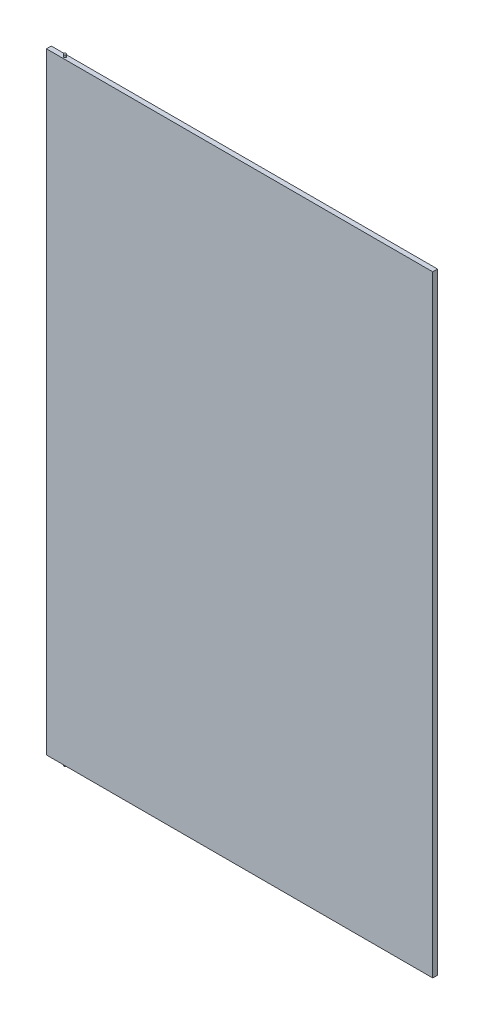
ISO-10303-21;
HEADER;
FILE_DESCRIPTION(('STEP AP214'),'2;1');
FILE_NAME('part.step','',(''),(''),'','','');
FILE_SCHEMA(('AUTOMOTIVE_DESIGN { 1 0 10303 214 1 1 1 1 }'));
ENDSEC;
DATA;
#1=APPLICATION_CONTEXT('core data for automotive mechanical design processes');
#2=APPLICATION_PROTOCOL_DEFINITION('international standard','automotive_design',2000,#1);
#3=PRODUCT_CONTEXT('',#1,'mechanical');
#4=PRODUCT('Part','Part','',(#3));
#5=PRODUCT_RELATED_PRODUCT_CATEGORY('part','',(#4));
#6=PRODUCT_DEFINITION_FORMATION('','',#4);
#7=PRODUCT_DEFINITION_CONTEXT('part definition',#1,'design');
#8=PRODUCT_DEFINITION('design','',#6,#7);
#9=PRODUCT_DEFINITION_SHAPE('','',#8);
#10=(LENGTH_UNIT() NAMED_UNIT(*) SI_UNIT(.MILLI.,.METRE.));
#11=(NAMED_UNIT(*) PLANE_ANGLE_UNIT() SI_UNIT($,.RADIAN.));
#12=(NAMED_UNIT(*) SI_UNIT($,.STERADIAN.) SOLID_ANGLE_UNIT());
#13=UNCERTAINTY_MEASURE_WITH_UNIT(LENGTH_MEASURE(1.E-05),#10,'distance_accuracy_value','');
#14=(GEOMETRIC_REPRESENTATION_CONTEXT(3) GLOBAL_UNCERTAINTY_ASSIGNED_CONTEXT((#13)) GLOBAL_UNIT_ASSIGNED_CONTEXT((#10,
#11,#12)) REPRESENTATION_CONTEXT('',''));
#15=CARTESIAN_POINT('',(0.,0.,0.));
#16=DIRECTION('',(0.,0.,1.));
#17=DIRECTION('',(1.,0.,0.));
#18=AXIS2_PLACEMENT_3D('',#15,#16,#17);
#19=CARTESIAN_POINT('',(0.,0.,3.));
#20=DIRECTION('',(-1.,0.,0.));
#21=DIRECTION('',(0.,0.,1.));
#22=AXIS2_PLACEMENT_3D('',#19,#20,#21);
#23=PLANE('',#22);
#24=DIRECTION('',(0.,1.,0.));
#25=VECTOR('',#24,1.);
#26=CARTESIAN_POINT('',(0.,0.,0.));
#27=LINE('',#26,#25);
#28=CARTESIAN_POINT('',(0.,0.,0.));
#29=VERTEX_POINT('',#28);
#30=CARTESIAN_POINT('',(0.,380.,0.));
#31=VERTEX_POINT('',#30);
#32=EDGE_CURVE('E117',#29,#31,#27,.T.);
#33=ORIENTED_EDGE('',*,*,#32,.T.);
#34=DIRECTION('',(0.,0.,-1.));
#35=VECTOR('',#34,1.);
#36=CARTESIAN_POINT('',(0.,380.,3.));
#37=LINE('',#36,#35);
#38=CARTESIAN_POINT('',(0.,380.,3.));
#39=VERTEX_POINT('',#38);
#40=EDGE_CURVE('E106',#39,#31,#37,.T.);
#41=ORIENTED_EDGE('',*,*,#40,.F.);
#42=DIRECTION('',(0.,1.,0.));
#43=VECTOR('',#42,1.);
#44=CARTESIAN_POINT('',(0.,0.,3.));
#45=LINE('',#44,#43);
#46=CARTESIAN_POINT('',(0.,0.,3.));
#47=VERTEX_POINT('',#46);
#48=EDGE_CURVE('E98',#47,#39,#45,.T.);
#49=ORIENTED_EDGE('',*,*,#48,.F.);
#50=DIRECTION('',(0.,0.,-1.));
#51=VECTOR('',#50,1.);
#52=CARTESIAN_POINT('',(0.,0.,3.));
#53=LINE('',#52,#51);
#54=EDGE_CURVE('E113',#47,#29,#53,.T.);
#55=ORIENTED_EDGE('',*,*,#54,.T.);
#56=EDGE_LOOP('',(#33,#41,#49,#55));
#57=FACE_BOUND('',#56,.T.);
#58=ADVANCED_FACE('F45',(#57),#23,.F.);
#59=CARTESIAN_POINT('',(0.,380.,3.));
#60=DIRECTION('',(0.,-1.,0.));
#61=DIRECTION('',(1.,0.,0.));
#62=AXIS2_PLACEMENT_3D('',#59,#60,#61);
#63=PLANE('',#62);
#64=CARTESIAN_POINT('',(-230.,380.,1.5));
#65=DIRECTION('',(0.,-1.,0.));
#66=DIRECTION('',(1.,0.,0.));
#67=AXIS2_PLACEMENT_3D('',#64,#65,#66);
#68=CIRCLE('',#67,0.750000000000041);
#69=CARTESIAN_POINT('',(-229.25,380.,1.5));
#70=VERTEX_POINT('',#69);
#71=EDGE_CURVE('E11',#70,#70,#68,.F.);
#72=ORIENTED_EDGE('',*,*,#71,.F.);
#73=EDGE_LOOP('',(#72));
#74=FACE_BOUND('',#73,.T.);
#75=DIRECTION('',(-1.,0.,0.));
#76=VECTOR('',#75,1.);
#77=CARTESIAN_POINT('',(0.,380.,0.));
#78=LINE('',#77,#76);
#79=CARTESIAN_POINT('',(-240.,380.,0.));
#80=VERTEX_POINT('',#79);
#81=EDGE_CURVE('E104',#31,#80,#78,.T.);
#82=ORIENTED_EDGE('',*,*,#81,.T.);
#83=DIRECTION('',(0.,0.,-1.));
#84=VECTOR('',#83,1.);
#85=CARTESIAN_POINT('',(-240.,380.,3.));
#86=LINE('',#85,#84);
#87=CARTESIAN_POINT('',(-240.,380.,3.));
#88=VERTEX_POINT('',#87);
#89=EDGE_CURVE('E102',#88,#80,#86,.T.);
#90=ORIENTED_EDGE('',*,*,#89,.F.);
#91=DIRECTION('',(-1.,0.,0.));
#92=VECTOR('',#91,1.);
#93=CARTESIAN_POINT('',(0.,380.,3.));
#94=LINE('',#93,#92);
#95=EDGE_CURVE('E93',#39,#88,#94,.T.);
#96=ORIENTED_EDGE('',*,*,#95,.F.);
#97=ORIENTED_EDGE('',*,*,#40,.T.);
#98=EDGE_LOOP('',(#82,#90,#96,#97));
#99=FACE_BOUND('',#98,.T.);
#100=ADVANCED_FACE('F103',(#74,#99),#63,.F.);
#101=CARTESIAN_POINT('',(-240.,0.,3.));
#102=DIRECTION('',(1.,0.,0.));
#103=DIRECTION('',(0.,0.,-1.));
#104=AXIS2_PLACEMENT_3D('',#101,#102,#103);
#105=PLANE('',#104);
#106=DIRECTION('',(0.,-1.,0.));
#107=VECTOR('',#106,1.);
#108=CARTESIAN_POINT('',(-240.,0.,0.));
#109=LINE('',#108,#107);
#110=CARTESIAN_POINT('',(-240.,0.,0.));
#111=VERTEX_POINT('',#110);
#112=EDGE_CURVE('E79',#80,#111,#109,.T.);
#113=ORIENTED_EDGE('',*,*,#112,.T.);
#114=DIRECTION('',(0.,0.,-1.));
#115=VECTOR('',#114,1.);
#116=CARTESIAN_POINT('',(-240.,0.,3.));
#117=LINE('',#116,#115);
#118=CARTESIAN_POINT('',(-240.,0.,3.));
#119=VERTEX_POINT('',#118);
#120=EDGE_CURVE('E107',#119,#111,#117,.T.);
#121=ORIENTED_EDGE('',*,*,#120,.F.);
#122=DIRECTION('',(0.,-1.,0.));
#123=VECTOR('',#122,1.);
#124=CARTESIAN_POINT('',(-240.,0.,3.));
#125=LINE('',#124,#123);
#126=EDGE_CURVE('E96',#88,#119,#125,.T.);
#127=ORIENTED_EDGE('',*,*,#126,.F.);
#128=ORIENTED_EDGE('',*,*,#89,.T.);
#129=EDGE_LOOP('',(#113,#121,#127,#128));
#130=FACE_BOUND('',#129,.T.);
#131=ADVANCED_FACE('F109',(#130),#105,.F.);
#132=CARTESIAN_POINT('',(0.,0.,3.));
#133=DIRECTION('',(0.,1.,0.));
#134=DIRECTION('',(-1.,0.,0.));
#135=AXIS2_PLACEMENT_3D('',#132,#133,#134);
#136=PLANE('',#135);
#137=CARTESIAN_POINT('',(-230.,0.,1.43569605502578));
#138=DIRECTION('',(0.,1.,0.));
#139=DIRECTION('',(-1.,0.,0.));
#140=AXIS2_PLACEMENT_3D('',#137,#138,#139);
#141=CIRCLE('',#140,0.750000000000041);
#142=CARTESIAN_POINT('',(-230.75,0.,1.43569605502578));
#143=VERTEX_POINT('',#142);
#144=EDGE_CURVE('E54',#143,#143,#141,.F.);
#145=ORIENTED_EDGE('',*,*,#144,.F.);
#146=EDGE_LOOP('',(#145));
#147=FACE_BOUND('',#146,.T.);
#148=DIRECTION('',(1.,0.,0.));
#149=VECTOR('',#148,1.);
#150=CARTESIAN_POINT('',(0.,0.,0.));
#151=LINE('',#150,#149);
#152=EDGE_CURVE('E85',#111,#29,#151,.T.);
#153=ORIENTED_EDGE('',*,*,#152,.T.);
#154=ORIENTED_EDGE('',*,*,#54,.F.);
#155=DIRECTION('',(1.,0.,0.));
#156=VECTOR('',#155,1.);
#157=CARTESIAN_POINT('',(0.,0.,3.));
#158=LINE('',#157,#156);
#159=EDGE_CURVE('E62',#119,#47,#158,.T.);
#160=ORIENTED_EDGE('',*,*,#159,.F.);
#161=ORIENTED_EDGE('',*,*,#120,.T.);
#162=EDGE_LOOP('',(#153,#154,#160,#161));
#163=FACE_BOUND('',#162,.T.);
#164=ADVANCED_FACE('F139',(#147,#163),#136,.F.);
#165=CARTESIAN_POINT('',(0.,0.,3.));
#166=DIRECTION('',(0.,0.,1.));
#167=DIRECTION('',(1.,0.,0.));
#168=AXIS2_PLACEMENT_3D('',#165,#166,#167);
#169=PLANE('',#168);
#170=ORIENTED_EDGE('',*,*,#48,.T.);
#171=ORIENTED_EDGE('',*,*,#95,.T.);
#172=ORIENTED_EDGE('',*,*,#126,.T.);
#173=ORIENTED_EDGE('',*,*,#159,.T.);
#174=EDGE_LOOP('',(#170,#171,#172,#173));
#175=FACE_BOUND('',#174,.T.);
#176=ADVANCED_FACE('F94',(#175),#169,.T.);
#177=CARTESIAN_POINT('',(0.,0.,0.));
#178=DIRECTION('',(0.,0.,1.));
#179=DIRECTION('',(1.,0.,0.));
#180=AXIS2_PLACEMENT_3D('',#177,#178,#179);
#181=PLANE('',#180);
#182=ORIENTED_EDGE('',*,*,#32,.F.);
#183=ORIENTED_EDGE('',*,*,#152,.F.);
#184=ORIENTED_EDGE('',*,*,#112,.F.);
#185=ORIENTED_EDGE('',*,*,#81,.F.);
#186=EDGE_LOOP('',(#182,#183,#184,#185));
#187=FACE_BOUND('',#186,.T.);
#188=ADVANCED_FACE('F147',(#187),#181,.F.);
#189=CARTESIAN_POINT('',(-230.,-1.50000000000003,1.43569605502578));
#190=DIRECTION('',(0.,1.,0.));
#191=DIRECTION('',(-1.,0.,0.));
#192=AXIS2_PLACEMENT_3D('',#189,#190,#191);
#193=CYLINDRICAL_SURFACE('',#192,0.750000000000041);
#194=CARTESIAN_POINT('',(-230.,-1.50000000000003,1.43569605502578));
#195=DIRECTION('',(0.,-1.,0.));
#196=DIRECTION('',(1.,0.,0.));
#197=AXIS2_PLACEMENT_3D('',#194,#195,#196);
#198=CIRCLE('',#197,0.750000000000041);
#199=CARTESIAN_POINT('',(-229.25,-1.50000000000003,1.43569605502578));
#200=VERTEX_POINT('',#199);
#201=EDGE_CURVE('E121',#200,#200,#198,.T.);
#202=ORIENTED_EDGE('',*,*,#201,.F.);
#203=EDGE_LOOP('',(#202));
#204=FACE_BOUND('',#203,.T.);
#205=ORIENTED_EDGE('',*,*,#144,.T.);
#206=EDGE_LOOP('',(#205));
#207=FACE_BOUND('',#206,.T.);
#208=ADVANCED_FACE('F137',(#204,#207),#193,.T.);
#209=CARTESIAN_POINT('',(-230.,-1.50000000000003,1.43569605502578));
#210=DIRECTION('',(0.,-1.,0.));
#211=DIRECTION('',(1.,0.,0.));
#212=AXIS2_PLACEMENT_3D('',#209,#210,#211);
#213=PLANE('',#212);
#214=ORIENTED_EDGE('',*,*,#201,.T.);
#215=EDGE_LOOP('',(#214));
#216=FACE_BOUND('',#215,.T.);
#217=ADVANCED_FACE('F162',(#216),#213,.T.);
#218=CARTESIAN_POINT('',(-230.,381.5,1.5));
#219=DIRECTION('',(0.,-1.,0.));
#220=DIRECTION('',(0.,0.,-1.));
#221=AXIS2_PLACEMENT_3D('',#218,#219,#220);
#222=CYLINDRICAL_SURFACE('',#221,0.750000000000041);
#223=CARTESIAN_POINT('',(-230.,381.5,1.5));
#224=DIRECTION('',(0.,1.,0.));
#225=DIRECTION('',(0.,0.,1.));
#226=AXIS2_PLACEMENT_3D('',#223,#224,#225);
#227=CIRCLE('',#226,0.750000000000041);
#228=CARTESIAN_POINT('',(-230.,381.5,2.25000000000004));
#229=VERTEX_POINT('',#228);
#230=EDGE_CURVE('E180',#229,#229,#227,.T.);
#231=ORIENTED_EDGE('',*,*,#230,.F.);
#232=EDGE_LOOP('',(#231));
#233=FACE_BOUND('',#232,.T.);
#234=ORIENTED_EDGE('',*,*,#71,.T.);
#235=EDGE_LOOP('',(#234));
#236=FACE_BOUND('',#235,.T.);
#237=ADVANCED_FACE('F168',(#233,#236),#222,.T.);
#238=CARTESIAN_POINT('',(-230.,381.5,1.5));
#239=DIRECTION('',(0.,1.,0.));
#240=DIRECTION('',(0.,0.,1.));
#241=AXIS2_PLACEMENT_3D('',#238,#239,#240);
#242=PLANE('',#241);
#243=ORIENTED_EDGE('',*,*,#230,.T.);
#244=EDGE_LOOP('',(#243));
#245=FACE_BOUND('',#244,.T.);
#246=ADVANCED_FACE('F172',(#245),#242,.T.);
#247=CLOSED_SHELL('',(#58,#100,#131,#164,#176,#188,#208,#217,#237,#246));
#248=MANIFOLD_SOLID_BREP('B2',#247);
#249=ADVANCED_BREP_SHAPE_REPRESENTATION('',(#18,#248),#14);
#250=SHAPE_DEFINITION_REPRESENTATION(#9,#249);
ENDSEC;
END-ISO-10303-21;
